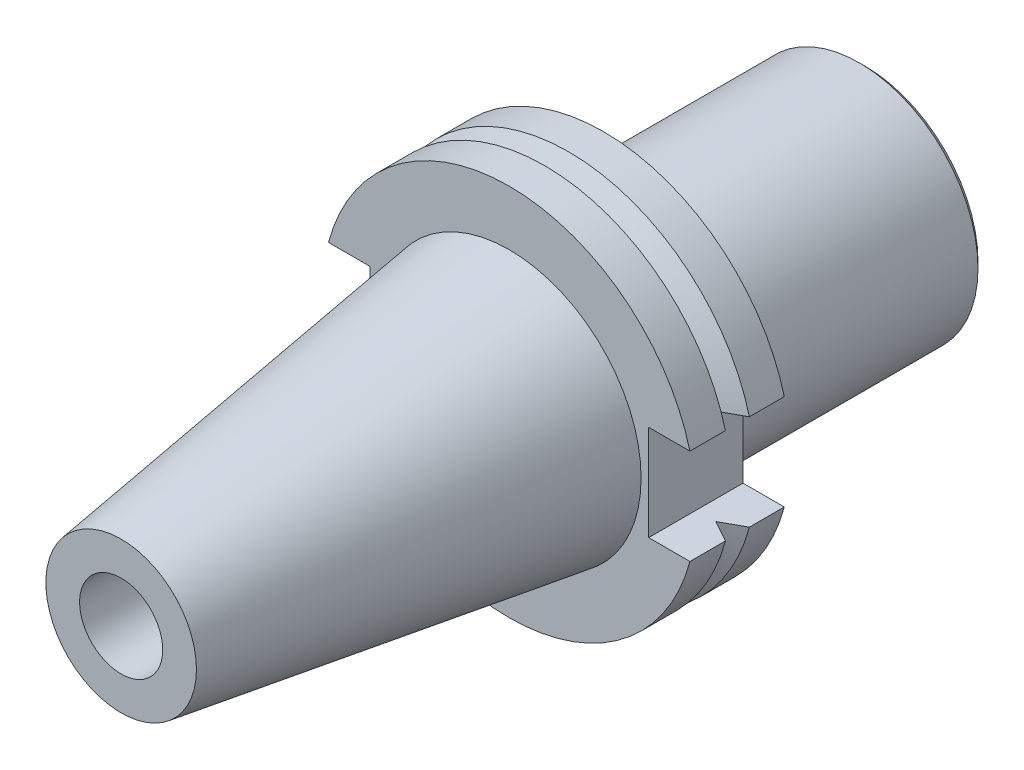
ISO-10303-21;
HEADER;
FILE_DESCRIPTION(('STEP AP214'),'2;1');
FILE_NAME('part.step','',(''),(''),'','','');
FILE_SCHEMA(('AUTOMOTIVE_DESIGN { 1 0 10303 214 1 1 1 1 }'));
ENDSEC;
DATA;
#1=APPLICATION_CONTEXT('core data for automotive mechanical design processes');
#2=APPLICATION_PROTOCOL_DEFINITION('international standard','automotive_design',2000,#1);
#3=PRODUCT_CONTEXT('',#1,'mechanical');
#4=PRODUCT('Part','Part','',(#3));
#5=PRODUCT_RELATED_PRODUCT_CATEGORY('part','',(#4));
#6=PRODUCT_DEFINITION_FORMATION('','',#4);
#7=PRODUCT_DEFINITION_CONTEXT('part definition',#1,'design');
#8=PRODUCT_DEFINITION('design','',#6,#7);
#9=PRODUCT_DEFINITION_SHAPE('','',#8);
#10=(LENGTH_UNIT() NAMED_UNIT(*) SI_UNIT(.MILLI.,.METRE.));
#11=(NAMED_UNIT(*) PLANE_ANGLE_UNIT() SI_UNIT($,.RADIAN.));
#12=(NAMED_UNIT(*) SI_UNIT($,.STERADIAN.) SOLID_ANGLE_UNIT());
#13=UNCERTAINTY_MEASURE_WITH_UNIT(LENGTH_MEASURE(1.E-05),#10,'distance_accuracy_value','');
#14=(GEOMETRIC_REPRESENTATION_CONTEXT(3) GLOBAL_UNCERTAINTY_ASSIGNED_CONTEXT((#13)) GLOBAL_UNIT_ASSIGNED_CONTEXT((#10,
#11,#12)) REPRESENTATION_CONTEXT('',''));
#15=CARTESIAN_POINT('',(0.,0.,0.));
#16=DIRECTION('',(0.,0.,1.));
#17=DIRECTION('',(1.,0.,0.));
#18=AXIS2_PLACEMENT_3D('',#15,#16,#17);
#19=CARTESIAN_POINT('',(0.,0.,65.4));
#20=DIRECTION('',(0.,0.,1.));
#21=DIRECTION('',(1.,0.,0.));
#22=AXIS2_PLACEMENT_3D('',#19,#20,#21);
#23=CYLINDRICAL_SURFACE('',#22,31.5);
#24=DIRECTION('',(0.,0.,1.));
#25=VECTOR('',#24,1.);
#26=CARTESIAN_POINT('',(30.4540227227866,8.05,65.4));
#27=LINE('',#26,#25);
#28=CARTESIAN_POINT('',(30.4540227227866,8.05,-15.9));
#29=VERTEX_POINT('',#28);
#30=CARTESIAN_POINT('',(30.4540227227866,8.05,-10.020725));
#31=VERTEX_POINT('',#30);
#32=EDGE_CURVE('E320',#29,#31,#27,.T.);
#33=ORIENTED_EDGE('',*,*,#32,.F.);
#34=CARTESIAN_POINT('',(0.,0.,-15.9));
#35=DIRECTION('',(0.,0.,1.));
#36=DIRECTION('',(1.,0.,0.));
#37=AXIS2_PLACEMENT_3D('',#34,#35,#36);
#38=CIRCLE('',#37,31.5);
#39=CARTESIAN_POINT('',(-30.4540227227866,8.05,-15.9));
#40=VERTEX_POINT('',#39);
#41=EDGE_CURVE('E351',#29,#40,#38,.T.);
#42=ORIENTED_EDGE('',*,*,#41,.T.);
#43=DIRECTION('',(0.,0.,1.));
#44=VECTOR('',#43,1.);
#45=CARTESIAN_POINT('',(-30.4540227227866,8.05,65.4));
#46=LINE('',#45,#44);
#47=CARTESIAN_POINT('',(-30.4540227227866,8.05,-10.020725));
#48=VERTEX_POINT('',#47);
#49=EDGE_CURVE('E260',#48,#40,#46,.F.);
#50=ORIENTED_EDGE('',*,*,#49,.F.);
#51=CARTESIAN_POINT('',(0.,0.,-10.020725));
#52=DIRECTION('',(0.,0.,-1.));
#53=DIRECTION('',(-1.,0.,0.));
#54=AXIS2_PLACEMENT_3D('',#51,#52,#53);
#55=CIRCLE('',#54,31.5);
#56=EDGE_CURVE('E342',#48,#31,#55,.T.);
#57=ORIENTED_EDGE('',*,*,#56,.T.);
#58=EDGE_LOOP('',(#33,#42,#50,#57));
#59=FACE_BOUND('',#58,.T.);
#60=ADVANCED_FACE('F51',(#59),#23,.T.);
#61=CARTESIAN_POINT('',(0.,0.,-10.3094));
#62=DIRECTION('',(0.,0.,-1.));
#63=DIRECTION('',(-1.,0.,0.));
#64=AXIS2_PLACEMENT_3D('',#61,#62,#63);
#65=CONICAL_SURFACE('',#64,32.,1.04719775308884);
#66=CARTESIAN_POINT('',(39.7514622989228,8.05,-15.2505740500649));
#67=CARTESIAN_POINT('',(38.7375794427899,8.05,-14.6768843385956));
#68=CARTESIAN_POINT('',(37.7233495112068,8.05,-14.1038062761903));
#69=CARTESIAN_POINT('',(35.6939559264031,8.05,-12.9593148687635));
#70=CARTESIAN_POINT('',(34.6787922766526,8.05,-12.3879015175877));
#71=CARTESIAN_POINT('',(32.6473671902745,8.05,-11.2472233085017));
#72=CARTESIAN_POINT('',(31.6311058501379,8.05,-10.6779582788319));
#73=CARTESIAN_POINT('',(29.597031458743,8.05,-9.54219070241251));
#74=CARTESIAN_POINT('',(28.5792183980375,8.05,-8.97568817257056));
#75=CARTESIAN_POINT('',(26.5414287246424,8.05,-7.84635750076335));
#76=CARTESIAN_POINT('',(25.5214519163326,8.05,-7.28352971157407));
#77=CARTESIAN_POINT('',(23.4786738109666,8.05,-6.16304932727975));
#78=CARTESIAN_POINT('',(22.455872557207,8.05,-5.60539665340947));
#79=CARTESIAN_POINT('',(20.9185737936278,8.05,-4.7745328012065));
#80=CARTESIAN_POINT('',(20.4056008747196,8.05,-4.49850137835459));
#81=CARTESIAN_POINT('',(19.3784142743255,8.05,-3.94876154777071));
#82=CARTESIAN_POINT('',(18.8642005991113,8.05,-3.67505312832806));
#83=CARTESIAN_POINT('',(17.8342256824117,8.05,-3.13049588904046));
#84=CARTESIAN_POINT('',(17.3184643637085,8.05,-2.85964721503148));
#85=CARTESIAN_POINT('',(16.5434009565917,8.05,-2.45609356430836));
#86=CARTESIAN_POINT('',(16.2848073130013,8.05,-2.32202774586417));
#87=CARTESIAN_POINT('',(15.7670869800636,8.05,-2.05492707318908));
#88=CARTESIAN_POINT('',(15.5079602886761,8.05,-1.92189222291352));
#89=CARTESIAN_POINT('',(15.2485377010772,8.05,-1.78943521854871));
#90=B_SPLINE_CURVE_WITH_KNOTS('',3,(#66,#67,#68,#69,#70,#71,#72,#73,#74,#75,#76,#77,#78,#79,#80,
#81,#82,#83,#84,#85,#86,#87,#88,#89),.UNSPECIFIED.,.F.,.F.,(4,2,2,2,2,2,2,2,2,2,2,4),(0.,
3.49481223341275,6.98961153065348,10.4841252317905,13.978660293995,17.4735260400842,
20.9683385067897,22.715906764079,24.4634662063209,26.2111143410334,27.0849537060668,
27.9587964219485),.UNSPECIFIED.);
#91=CARTESIAN_POINT('',(26.8178578562867,8.05,-8.));
#92=VERTEX_POINT('',#91);
#93=EDGE_CURVE('E313',#31,#92,#90,.T.);
#94=ORIENTED_EDGE('',*,*,#93,.F.);
#95=ORIENTED_EDGE('',*,*,#56,.F.);
#96=CARTESIAN_POINT('',(-15.2485377010772,8.05,-1.78943521854871));
#97=CARTESIAN_POINT('',(-15.5916110343136,8.05,-1.9646110043633));
#98=CARTESIAN_POINT('',(-15.9341715544753,8.05,-2.1407873482956));
#99=CARTESIAN_POINT('',(-16.6183922268298,8.05,-2.49487426660718));
#100=CARTESIAN_POINT('',(-16.9600523855997,8.05,-2.67278482827311));
#101=CARTESIAN_POINT('',(-17.6425931502126,8.05,-3.03007091555391));
#102=CARTESIAN_POINT('',(-17.9834737774147,8.05,-3.20944640039938));
#103=CARTESIAN_POINT('',(-18.6645653353504,8.05,-3.56946546957345));
#104=CARTESIAN_POINT('',(-19.0047762646719,8.05,-3.75010905657245));
#105=CARTESIAN_POINT('',(-20.0244897057141,8.05,-4.29365206630128));
#106=CARTESIAN_POINT('',(-20.7031198135981,8.05,-4.65818837430353));
#107=CARTESIAN_POINT('',(-22.0585899389783,8.05,-5.39058232129538));
#108=CARTESIAN_POINT('',(-22.7354299415383,8.05,-5.75843998788523));
#109=CARTESIAN_POINT('',(-24.087629684218,8.05,-6.49670884549036));
#110=CARTESIAN_POINT('',(-24.7629895618946,8.05,-6.86711978469141));
#111=CARTESIAN_POINT('',(-26.1125763620363,8.05,-7.60999409496285));
#112=CARTESIAN_POINT('',(-26.7868032877578,8.05,-7.98245746012054));
#113=CARTESIAN_POINT('',(-28.1343514607373,8.05,-8.72904663303512));
#114=CARTESIAN_POINT('',(-28.8076726916146,8.05,-9.1031724703468));
#115=CARTESIAN_POINT('',(-30.1535614024565,8.05,-9.85277794248402));
#116=CARTESIAN_POINT('',(-30.8261288819969,8.05,-10.2282575780709));
#117=CARTESIAN_POINT('',(-32.1871867195783,8.05,-10.9895941808429));
#118=CARTESIAN_POINT('',(-32.8756614610951,8.05,-11.3754790596674));
#119=CARTESIAN_POINT('',(-34.2520561934165,8.05,-12.1482260402481));
#120=CARTESIAN_POINT('',(-34.93997618787,8.05,-12.5350881355062));
#121=CARTESIAN_POINT('',(-36.3153814213353,8.05,-13.309652039574));
#122=CARTESIAN_POINT('',(-37.0028666407764,8.05,-13.6973538831291));
#123=CARTESIAN_POINT('',(-38.3774439079256,8.05,-14.4734643210686));
#124=CARTESIAN_POINT('',(-39.0645359530695,8.05,-14.8618729199949));
#125=CARTESIAN_POINT('',(-39.7514622989228,8.05,-15.2505740500649));
#126=B_SPLINE_CURVE_WITH_KNOTS('',3,(#96,#97,#98,#99,#100,#101,#102,#103,#104,#105,#106,#107,
#108,#109,#110,#111,#112,#113,#114,#115,#116,#117,#118,#119,#120,#121,#122,#123,#124,#125),
.UNSPECIFIED.,.F.,.F.,(4,2,2,2,2,2,2,2,2,2,2,2,2,2,4),(0.,1.15562246364795,2.31123646193108,
3.46681840787613,4.6224027880085,6.93341250597456,9.24444144596615,11.5552456340298,
13.8660431685069,16.1768819491207,18.4877220294254,20.8554502589415,23.2231627847701,
25.590975223069,27.9588029317647),.UNSPECIFIED.);
#127=CARTESIAN_POINT('',(-26.8178578562867,8.05,-8.));
#128=VERTEX_POINT('',#127);
#129=EDGE_CURVE('E253',#128,#48,#126,.T.);
#130=ORIENTED_EDGE('',*,*,#129,.F.);
#131=CARTESIAN_POINT('',(0.,0.,-8.));
#132=DIRECTION('',(0.,0.,-1.));
#133=DIRECTION('',(-1.,0.,0.));
#134=AXIS2_PLACEMENT_3D('',#131,#132,#133);
#135=CIRCLE('',#134,28.);
#136=EDGE_CURVE('E333',#128,#92,#135,.T.);
#137=ORIENTED_EDGE('',*,*,#136,.T.);
#138=EDGE_LOOP('',(#94,#95,#130,#137));
#139=FACE_BOUND('',#138,.T.);
#140=ADVANCED_FACE('F270',(#139),#65,.T.);
#141=CARTESIAN_POINT('',(0.,0.,-8.));
#142=DIRECTION('',(0.,0.,1.));
#143=DIRECTION('',(1.,0.,0.));
#144=AXIS2_PLACEMENT_3D('',#141,#142,#143);
#145=CONICAL_SURFACE('',#144,28.,1.04719775308884);
#146=CARTESIAN_POINT('',(15.2485377010772,8.05,-14.2105647814513));
#147=CARTESIAN_POINT('',(15.5916110343136,8.05,-14.0353889956367));
#148=CARTESIAN_POINT('',(15.9341715544753,8.05,-13.8592126517044));
#149=CARTESIAN_POINT('',(16.6183922268298,8.05,-13.5051257333928));
#150=CARTESIAN_POINT('',(16.9600523855997,8.05,-13.3272151717269));
#151=CARTESIAN_POINT('',(17.6425931502126,8.05,-12.9699290844461));
#152=CARTESIAN_POINT('',(17.9834737774147,8.05,-12.7905535996006));
#153=CARTESIAN_POINT('',(18.6645653353504,8.05,-12.4305345304266));
#154=CARTESIAN_POINT('',(19.0047762646719,8.05,-12.2498909434276));
#155=CARTESIAN_POINT('',(20.0244897057141,8.05,-11.7063479336987));
#156=CARTESIAN_POINT('',(20.7031198135981,8.05,-11.3418116256965));
#157=CARTESIAN_POINT('',(22.0585899389783,8.05,-10.6094176787046));
#158=CARTESIAN_POINT('',(22.7354299415383,8.05,-10.2415600121148));
#159=CARTESIAN_POINT('',(24.087629684218,8.05,-9.50329115450964));
#160=CARTESIAN_POINT('',(24.7629895618946,8.05,-9.13288021530859));
#161=CARTESIAN_POINT('',(26.1125763620363,8.05,-8.39000590503715));
#162=CARTESIAN_POINT('',(26.7868032877578,8.05,-8.01754253987946));
#163=CARTESIAN_POINT('',(28.1343514607373,8.05,-7.27095336696488));
#164=CARTESIAN_POINT('',(28.8076726916146,8.05,-6.8968275296532));
#165=CARTESIAN_POINT('',(30.1535614024565,8.05,-6.14722205751598));
#166=CARTESIAN_POINT('',(30.8261288819969,8.05,-5.77174242192914));
#167=CARTESIAN_POINT('',(32.1871867195783,8.05,-5.0104058191571));
#168=CARTESIAN_POINT('',(32.8756614610951,8.05,-4.62452094033265));
#169=CARTESIAN_POINT('',(34.2520561934165,8.05,-3.85177395975188));
#170=CARTESIAN_POINT('',(34.93997618787,8.05,-3.46491186449385));
#171=CARTESIAN_POINT('',(36.3153814213353,8.05,-2.69034796042602));
#172=CARTESIAN_POINT('',(37.0028666407764,8.05,-2.30264611687094));
#173=CARTESIAN_POINT('',(38.3774439079256,8.05,-1.52653567893138));
#174=CARTESIAN_POINT('',(39.0645359530695,8.05,-1.13812708000506));
#175=CARTESIAN_POINT('',(39.7514622989228,8.05,-0.749425949935081));
#176=B_SPLINE_CURVE_WITH_KNOTS('',3,(#146,#147,#148,#149,#150,#151,#152,#153,#154,#155,#156,
#157,#158,#159,#160,#161,#162,#163,#164,#165,#166,#167,#168,#169,#170,#171,#172,#173,#174,#175),
.UNSPECIFIED.,.F.,.F.,(4,2,2,2,2,2,2,2,2,2,2,2,2,2,4),(0.,1.15562246364795,2.31123646193109,
3.46681840787613,4.6224027880085,6.93341250597455,9.24444144596615,11.5552456340298,
13.8660431685069,16.1768819491207,18.4877220294254,20.8554502589415,23.2231627847701,
25.590975223069,27.9588029317647),.UNSPECIFIED.);
#177=CARTESIAN_POINT('',(30.4540227227866,8.05,-5.97927499999999));
#178=VERTEX_POINT('',#177);
#179=EDGE_CURVE('E308',#92,#178,#176,.T.);
#180=ORIENTED_EDGE('',*,*,#179,.F.);
#181=ORIENTED_EDGE('',*,*,#136,.F.);
#182=CARTESIAN_POINT('',(-39.7514622989228,8.05,-0.749425949935077));
#183=CARTESIAN_POINT('',(-38.7375794427899,8.05,-1.32311566140442));
#184=CARTESIAN_POINT('',(-37.7233495112068,8.05,-1.89619372380967));
#185=CARTESIAN_POINT('',(-35.6939559264031,8.05,-3.04068513123652));
#186=CARTESIAN_POINT('',(-34.6787922766526,8.05,-3.61209848241227));
#187=CARTESIAN_POINT('',(-32.6473671902745,8.05,-4.7527766914983));
#188=CARTESIAN_POINT('',(-31.6311058501379,8.05,-5.3220417211681));
#189=CARTESIAN_POINT('',(-29.597031458743,8.05,-6.45780929758748));
#190=CARTESIAN_POINT('',(-28.5792183980375,8.05,-7.02431182742944));
#191=CARTESIAN_POINT('',(-26.5414287246424,8.05,-8.15364249923665));
#192=CARTESIAN_POINT('',(-25.5214519163326,8.05,-8.71647028842593));
#193=CARTESIAN_POINT('',(-23.4786738109666,8.05,-9.83695067272024));
#194=CARTESIAN_POINT('',(-22.455872557207,8.05,-10.3946033465905));
#195=CARTESIAN_POINT('',(-20.9185737936278,8.05,-11.2254671987935));
#196=CARTESIAN_POINT('',(-20.4056008747196,8.05,-11.5014986216454));
#197=CARTESIAN_POINT('',(-19.3784142743255,8.05,-12.0512384522293));
#198=CARTESIAN_POINT('',(-18.8642005991113,8.05,-12.3249468716719));
#199=CARTESIAN_POINT('',(-17.8342256824117,8.05,-12.8695041109595));
#200=CARTESIAN_POINT('',(-17.3184643637085,8.05,-13.1403527849685));
#201=CARTESIAN_POINT('',(-16.5434009565917,8.05,-13.5439064356916));
#202=CARTESIAN_POINT('',(-16.2848073130013,8.05,-13.6779722541358));
#203=CARTESIAN_POINT('',(-15.7670869800636,8.05,-13.9450729268109));
#204=CARTESIAN_POINT('',(-15.5079602886761,8.05,-14.0781077770865));
#205=CARTESIAN_POINT('',(-15.2485377010772,8.05,-14.2105647814513));
#206=B_SPLINE_CURVE_WITH_KNOTS('',3,(#182,#183,#184,#185,#186,#187,#188,#189,#190,#191,#192,
#193,#194,#195,#196,#197,#198,#199,#200,#201,#202,#203,#204,#205),.UNSPECIFIED.,.F.,.F.,(4,2,2,
2,2,2,2,2,2,2,2,4),(0.,3.49481223341275,6.98961153065348,10.4841252317905,13.978660293995,
17.4735260400842,20.9683385067897,22.715906764079,24.4634662063209,26.2111143410334,
27.0849537060668,27.9587964219485),.UNSPECIFIED.);
#207=CARTESIAN_POINT('',(-30.4540227227866,8.05,-5.97927499999999));
#208=VERTEX_POINT('',#207);
#209=EDGE_CURVE('E246',#208,#128,#206,.T.);
#210=ORIENTED_EDGE('',*,*,#209,.F.);
#211=CARTESIAN_POINT('',(0.,0.,-5.979275));
#212=DIRECTION('',(0.,0.,1.));
#213=DIRECTION('',(1.,0.,0.));
#214=AXIS2_PLACEMENT_3D('',#211,#212,#213);
#215=CIRCLE('',#214,31.5);
#216=EDGE_CURVE('E368',#178,#208,#215,.T.);
#217=ORIENTED_EDGE('',*,*,#216,.F.);
#218=EDGE_LOOP('',(#180,#181,#210,#217));
#219=FACE_BOUND('',#218,.T.);
#220=ADVANCED_FACE('F495',(#219),#145,.T.);
#221=DIRECTION('',(0.,0.,1.));
#222=VECTOR('',#221,1.);
#223=CARTESIAN_POINT('',(30.4540227227866,8.05,65.4));
#224=LINE('',#223,#222);
#225=CARTESIAN_POINT('',(30.4540227227866,8.05,0.));
#226=VERTEX_POINT('',#225);
#227=EDGE_CURVE('E11',#178,#226,#224,.T.);
#228=ORIENTED_EDGE('',*,*,#227,.F.);
#229=ORIENTED_EDGE('',*,*,#216,.T.);
#230=DIRECTION('',(0.,0.,1.));
#231=VECTOR('',#230,1.);
#232=CARTESIAN_POINT('',(-30.4540227227866,8.05,65.4));
#233=LINE('',#232,#231);
#234=CARTESIAN_POINT('',(-30.4540227227866,8.05,0.));
#235=VERTEX_POINT('',#234);
#236=EDGE_CURVE('E377',#235,#208,#233,.F.);
#237=ORIENTED_EDGE('',*,*,#236,.F.);
#238=CARTESIAN_POINT('',(0.,0.,0.));
#239=DIRECTION('',(0.,0.,1.));
#240=DIRECTION('',(1.,0.,0.));
#241=AXIS2_PLACEMENT_3D('',#238,#239,#240);
#242=CIRCLE('',#241,31.5);
#243=EDGE_CURVE('E355',#226,#235,#242,.T.);
#244=ORIENTED_EDGE('',*,*,#243,.F.);
#245=EDGE_LOOP('',(#228,#229,#237,#244));
#246=FACE_BOUND('',#245,.T.);
#247=ADVANCED_FACE('F492',(#246),#23,.T.);
#248=DIRECTION('',(0.,0.,1.));
#249=VECTOR('',#248,1.);
#250=CARTESIAN_POINT('',(30.4540227227866,-8.05,65.4));
#251=LINE('',#250,#249);
#252=CARTESIAN_POINT('',(30.4540227227866,-8.05,-10.020725));
#253=VERTEX_POINT('',#252);
#254=CARTESIAN_POINT('',(30.4540227227866,-8.05,-15.9));
#255=VERTEX_POINT('',#254);
#256=EDGE_CURVE('E285',#253,#255,#251,.F.);
#257=ORIENTED_EDGE('',*,*,#256,.F.);
#258=CARTESIAN_POINT('',(-30.4540227227866,-8.05,-10.020725));
#259=VERTEX_POINT('',#258);
#260=EDGE_CURVE('E372',#253,#259,#55,.T.);
#261=ORIENTED_EDGE('',*,*,#260,.T.);
#262=DIRECTION('',(0.,0.,1.));
#263=VECTOR('',#262,1.);
#264=CARTESIAN_POINT('',(-30.4540227227866,-8.05,65.4));
#265=LINE('',#264,#263);
#266=CARTESIAN_POINT('',(-30.4540227227866,-8.05,-15.9));
#267=VERTEX_POINT('',#266);
#268=EDGE_CURVE('E419',#267,#259,#265,.T.);
#269=ORIENTED_EDGE('',*,*,#268,.F.);
#270=EDGE_CURVE('E350',#267,#255,#38,.T.);
#271=ORIENTED_EDGE('',*,*,#270,.T.);
#272=EDGE_LOOP('',(#257,#261,#269,#271));
#273=FACE_BOUND('',#272,.T.);
#274=ADVANCED_FACE('F418',(#273),#23,.T.);
#275=CARTESIAN_POINT('',(31.5,0.,-15.9));
#276=DIRECTION('',(0.,0.,-1.));
#277=DIRECTION('',(-1.,0.,0.));
#278=AXIS2_PLACEMENT_3D('',#275,#276,#277);
#279=PLANE('',#278);
#280=CARTESIAN_POINT('',(0.,25.,-15.9));
#281=DIRECTION('',(0.,0.,1.));
#282=DIRECTION('',(1.,0.,0.));
#283=AXIS2_PLACEMENT_3D('',#280,#281,#282);
#284=CIRCLE('',#283,4.);
#285=CARTESIAN_POINT('',(4.,25.,-15.9));
#286=VERTEX_POINT('',#285);
#287=EDGE_CURVE('E402',#286,#286,#284,.T.);
#288=ORIENTED_EDGE('',*,*,#287,.T.);
#289=EDGE_LOOP('',(#288));
#290=FACE_BOUND('',#289,.T.);
#291=DIRECTION('',(1.,0.,0.));
#292=VECTOR('',#291,1.);
#293=CARTESIAN_POINT('',(31.5,8.05,-15.9));
#294=LINE('',#293,#292);
#295=CARTESIAN_POINT('',(23.5,8.05,-15.9));
#296=VERTEX_POINT('',#295);
#297=EDGE_CURVE('E323',#296,#29,#294,.T.);
#298=ORIENTED_EDGE('',*,*,#297,.F.);
#299=DIRECTION('',(0.,1.,0.));
#300=VECTOR('',#299,1.);
#301=CARTESIAN_POINT('',(23.5,0.,-15.9));
#302=LINE('',#301,#300);
#303=CARTESIAN_POINT('',(23.5,-8.05,-15.9));
#304=VERTEX_POINT('',#303);
#305=EDGE_CURVE('E329',#304,#296,#302,.T.);
#306=ORIENTED_EDGE('',*,*,#305,.F.);
#307=DIRECTION('',(-1.,0.,0.));
#308=VECTOR('',#307,1.);
#309=CARTESIAN_POINT('',(31.5,-8.05,-15.9));
#310=LINE('',#309,#308);
#311=EDGE_CURVE('E155',#255,#304,#310,.T.);
#312=ORIENTED_EDGE('',*,*,#311,.F.);
#313=ORIENTED_EDGE('',*,*,#270,.F.);
#314=DIRECTION('',(-1.,0.,0.));
#315=VECTOR('',#314,1.);
#316=CARTESIAN_POINT('',(31.5,-8.05,-15.9));
#317=LINE('',#316,#315);
#318=CARTESIAN_POINT('',(-23.5,-8.05,-15.9));
#319=VERTEX_POINT('',#318);
#320=EDGE_CURVE('E422',#319,#267,#317,.T.);
#321=ORIENTED_EDGE('',*,*,#320,.F.);
#322=DIRECTION('',(0.,-1.,0.));
#323=VECTOR('',#322,1.);
#324=CARTESIAN_POINT('',(-23.5,0.,-15.9));
#325=LINE('',#324,#323);
#326=CARTESIAN_POINT('',(-23.5,8.05,-15.9));
#327=VERTEX_POINT('',#326);
#328=EDGE_CURVE('E326',#327,#319,#325,.T.);
#329=ORIENTED_EDGE('',*,*,#328,.F.);
#330=DIRECTION('',(1.,0.,0.));
#331=VECTOR('',#330,1.);
#332=CARTESIAN_POINT('',(31.5,8.05,-15.9));
#333=LINE('',#332,#331);
#334=EDGE_CURVE('E390',#40,#327,#333,.T.);
#335=ORIENTED_EDGE('',*,*,#334,.F.);
#336=ORIENTED_EDGE('',*,*,#41,.F.);
#337=EDGE_LOOP('',(#298,#306,#312,#313,#321,#329,#335,#336));
#338=FACE_BOUND('',#337,.T.);
#339=CARTESIAN_POINT('',(0.,0.,-15.9));
#340=DIRECTION('',(0.,0.,1.));
#341=DIRECTION('',(1.,0.,0.));
#342=AXIS2_PLACEMENT_3D('',#339,#340,#341);
#343=CIRCLE('',#342,20.);
#344=CARTESIAN_POINT('',(20.,0.,-15.9));
#345=VERTEX_POINT('',#344);
#346=EDGE_CURVE('E346',#345,#345,#343,.T.);
#347=ORIENTED_EDGE('',*,*,#346,.T.);
#348=EDGE_LOOP('',(#347));
#349=FACE_BOUND('',#348,.T.);
#350=ADVANCED_FACE('F414',(#290,#338,#349),#279,.T.);
#351=CARTESIAN_POINT('',(0.,0.,65.4));
#352=DIRECTION('',(0.,0.,1.));
#353=DIRECTION('',(1.,0.,0.));
#354=AXIS2_PLACEMENT_3D('',#351,#352,#353);
#355=CYLINDRICAL_SURFACE('',#354,20.);
#356=CARTESIAN_POINT('',(0.,0.,-59.));
#357=DIRECTION('',(0.,0.,1.));
#358=DIRECTION('',(1.,0.,0.));
#359=AXIS2_PLACEMENT_3D('',#356,#357,#358);
#360=CIRCLE('',#359,20.);
#361=CARTESIAN_POINT('',(20.,0.,-59.));
#362=VERTEX_POINT('',#361);
#363=EDGE_CURVE('E341',#362,#362,#360,.T.);
#364=ORIENTED_EDGE('',*,*,#363,.T.);
#365=EDGE_LOOP('',(#364));
#366=FACE_BOUND('',#365,.T.);
#367=ORIENTED_EDGE('',*,*,#346,.F.);
#368=EDGE_LOOP('',(#367));
#369=FACE_BOUND('',#368,.T.);
#370=ADVANCED_FACE('F504',(#366,#369),#355,.T.);
#371=CARTESIAN_POINT('',(0.,0.,-59.));
#372=DIRECTION('',(0.,0.,1.));
#373=DIRECTION('',(1.,0.,0.));
#374=AXIS2_PLACEMENT_3D('',#371,#372,#373);
#375=CONICAL_SURFACE('',#374,20.,0.785398163397442);
#376=CARTESIAN_POINT('',(0.,0.,-60.));
#377=DIRECTION('',(0.,0.,1.));
#378=DIRECTION('',(1.,0.,0.));
#379=AXIS2_PLACEMENT_3D('',#376,#377,#378);
#380=CIRCLE('',#379,19.);
#381=CARTESIAN_POINT('',(19.,0.,-60.));
#382=VERTEX_POINT('',#381);
#383=EDGE_CURVE('E338',#382,#382,#380,.T.);
#384=ORIENTED_EDGE('',*,*,#383,.T.);
#385=EDGE_LOOP('',(#384));
#386=FACE_BOUND('',#385,.T.);
#387=ORIENTED_EDGE('',*,*,#363,.F.);
#388=EDGE_LOOP('',(#387));
#389=FACE_BOUND('',#388,.T.);
#390=ADVANCED_FACE('F590',(#386,#389),#375,.T.);
#391=CARTESIAN_POINT('',(19.,0.,-60.));
#392=DIRECTION('',(0.,0.,-1.));
#393=DIRECTION('',(-1.,0.,0.));
#394=AXIS2_PLACEMENT_3D('',#391,#392,#393);
#395=PLANE('',#394);
#396=CARTESIAN_POINT('',(0.,0.,-60.));
#397=DIRECTION('',(0.,0.,1.));
#398=DIRECTION('',(1.,0.,0.));
#399=AXIS2_PLACEMENT_3D('',#396,#397,#398);
#400=CIRCLE('',#399,10.);
#401=CARTESIAN_POINT('',(10.,0.,-60.));
#402=VERTEX_POINT('',#401);
#403=EDGE_CURVE('E444',#402,#402,#400,.T.);
#404=ORIENTED_EDGE('',*,*,#403,.T.);
#405=EDGE_LOOP('',(#404));
#406=FACE_BOUND('',#405,.T.);
#407=ORIENTED_EDGE('',*,*,#383,.F.);
#408=EDGE_LOOP('',(#407));
#409=FACE_BOUND('',#408,.T.);
#410=ADVANCED_FACE('F268',(#406,#409),#395,.T.);
#411=CARTESIAN_POINT('',(15.2485377010772,-8.05,-1.78943521854871));
#412=CARTESIAN_POINT('',(15.5916110343136,-8.05,-1.9646110043633));
#413=CARTESIAN_POINT('',(15.9341715544753,-8.05,-2.1407873482956));
#414=CARTESIAN_POINT('',(16.6183922268298,-8.05,-2.49487426660718));
#415=CARTESIAN_POINT('',(16.9600523855997,-8.05,-2.67278482827311));
#416=CARTESIAN_POINT('',(17.6425931502126,-8.05,-3.03007091555391));
#417=CARTESIAN_POINT('',(17.9834737774147,-8.05,-3.20944640039938));
#418=CARTESIAN_POINT('',(18.6645653353504,-8.05,-3.56946546957345));
#419=CARTESIAN_POINT('',(19.0047762646719,-8.05,-3.75010905657245));
#420=CARTESIAN_POINT('',(20.0244897057141,-8.05,-4.29365206630128));
#421=CARTESIAN_POINT('',(20.7031198135981,-8.05,-4.65818837430353));
#422=CARTESIAN_POINT('',(22.0585899389783,-8.05,-5.39058232129538));
#423=CARTESIAN_POINT('',(22.7354299415383,-8.05,-5.75843998788523));
#424=CARTESIAN_POINT('',(24.087629684218,-8.05,-6.49670884549036));
#425=CARTESIAN_POINT('',(24.7629895618946,-8.05,-6.86711978469141));
#426=CARTESIAN_POINT('',(26.1125763620363,-8.05,-7.60999409496285));
#427=CARTESIAN_POINT('',(26.7868032877578,-8.05,-7.98245746012054));
#428=CARTESIAN_POINT('',(28.1343514607373,-8.05,-8.72904663303512));
#429=CARTESIAN_POINT('',(28.8076726916146,-8.05,-9.1031724703468));
#430=CARTESIAN_POINT('',(30.1535614024565,-8.05,-9.85277794248402));
#431=CARTESIAN_POINT('',(30.8261288819969,-8.05,-10.2282575780709));
#432=CARTESIAN_POINT('',(32.1871867195783,-8.05,-10.9895941808429));
#433=CARTESIAN_POINT('',(32.8756614610951,-8.05,-11.3754790596674));
#434=CARTESIAN_POINT('',(34.2520561934165,-8.05,-12.1482260402481));
#435=CARTESIAN_POINT('',(34.93997618787,-8.05,-12.5350881355062));
#436=CARTESIAN_POINT('',(36.3153814213353,-8.05,-13.309652039574));
#437=CARTESIAN_POINT('',(37.0028666407764,-8.05,-13.6973538831291));
#438=CARTESIAN_POINT('',(38.3774439079256,-8.05,-14.4734643210686));
#439=CARTESIAN_POINT('',(39.0645359530695,-8.05,-14.8618729199949));
#440=CARTESIAN_POINT('',(39.7514622989228,-8.05,-15.2505740500649));
#441=B_SPLINE_CURVE_WITH_KNOTS('',3,(#411,#412,#413,#414,#415,#416,#417,#418,#419,#420,#421,
#422,#423,#424,#425,#426,#427,#428,#429,#430,#431,#432,#433,#434,#435,#436,#437,#438,#439,#440),
.UNSPECIFIED.,.F.,.F.,(4,2,2,2,2,2,2,2,2,2,2,2,2,2,4),(0.,1.15562246364795,2.31123646193108,
3.46681840787613,4.6224027880085,6.93341250597456,9.24444144596615,11.5552456340298,
13.8660431685069,16.1768819491207,18.4877220294254,20.8554502589415,23.2231627847701,
25.590975223069,27.9588029317647),.UNSPECIFIED.);
#442=CARTESIAN_POINT('',(26.8178578562867,-8.05,-8.));
#443=VERTEX_POINT('',#442);
#444=EDGE_CURVE('E277',#443,#253,#441,.T.);
#445=ORIENTED_EDGE('',*,*,#444,.F.);
#446=CARTESIAN_POINT('',(-26.8178578562867,-8.05,-8.));
#447=VERTEX_POINT('',#446);
#448=EDGE_CURVE('E332',#443,#447,#135,.T.);
#449=ORIENTED_EDGE('',*,*,#448,.T.);
#450=CARTESIAN_POINT('',(-39.7514622989228,-8.05,-15.2505740500649));
#451=CARTESIAN_POINT('',(-38.7375794427899,-8.05,-14.6768843385956));
#452=CARTESIAN_POINT('',(-37.7233495112068,-8.05,-14.1038062761903));
#453=CARTESIAN_POINT('',(-35.6939559264031,-8.05,-12.9593148687635));
#454=CARTESIAN_POINT('',(-34.6787922766526,-8.05,-12.3879015175877));
#455=CARTESIAN_POINT('',(-32.6473671902745,-8.05,-11.2472233085017));
#456=CARTESIAN_POINT('',(-31.6311058501379,-8.05,-10.6779582788319));
#457=CARTESIAN_POINT('',(-29.597031458743,-8.05,-9.54219070241251));
#458=CARTESIAN_POINT('',(-28.5792183980375,-8.05,-8.97568817257056));
#459=CARTESIAN_POINT('',(-26.5414287246424,-8.05,-7.84635750076335));
#460=CARTESIAN_POINT('',(-25.5214519163326,-8.05,-7.28352971157407));
#461=CARTESIAN_POINT('',(-23.4786738109666,-8.05,-6.16304932727975));
#462=CARTESIAN_POINT('',(-22.455872557207,-8.05,-5.60539665340947));
#463=CARTESIAN_POINT('',(-20.9185737936278,-8.05,-4.7745328012065));
#464=CARTESIAN_POINT('',(-20.4056008747196,-8.05,-4.49850137835459));
#465=CARTESIAN_POINT('',(-19.3784142743255,-8.05,-3.94876154777071));
#466=CARTESIAN_POINT('',(-18.8642005991113,-8.05,-3.67505312832806));
#467=CARTESIAN_POINT('',(-17.8342256824117,-8.05,-3.13049588904046));
#468=CARTESIAN_POINT('',(-17.3184643637085,-8.05,-2.85964721503148));
#469=CARTESIAN_POINT('',(-16.5434009565917,-8.05,-2.45609356430836));
#470=CARTESIAN_POINT('',(-16.2848073130013,-8.05,-2.32202774586417));
#471=CARTESIAN_POINT('',(-15.7670869800636,-8.05,-2.05492707318908));
#472=CARTESIAN_POINT('',(-15.5079602886761,-8.05,-1.92189222291352));
#473=CARTESIAN_POINT('',(-15.2485377010772,-8.05,-1.78943521854871));
#474=B_SPLINE_CURVE_WITH_KNOTS('',3,(#450,#451,#452,#453,#454,#455,#456,#457,#458,#459,#460,
#461,#462,#463,#464,#465,#466,#467,#468,#469,#470,#471,#472,#473),.UNSPECIFIED.,.F.,.F.,(4,2,2,
2,2,2,2,2,2,2,2,4),(0.,3.49481223341275,6.98961153065348,10.4841252317905,13.978660293995,
17.4735260400842,20.9683385067897,22.715906764079,24.4634662063209,26.2111143410334,
27.0849537060668,27.9587964219485),.UNSPECIFIED.);
#475=EDGE_CURVE('E213',#259,#447,#474,.T.);
#476=ORIENTED_EDGE('',*,*,#475,.F.);
#477=ORIENTED_EDGE('',*,*,#260,.F.);
#478=EDGE_LOOP('',(#445,#449,#476,#477));
#479=FACE_BOUND('',#478,.T.);
#480=ADVANCED_FACE('F263',(#479),#65,.T.);
#481=CARTESIAN_POINT('',(39.7514622989228,-8.05,-0.749425949935077));
#482=CARTESIAN_POINT('',(38.7375794427899,-8.05,-1.32311566140441));
#483=CARTESIAN_POINT('',(37.7233495112068,-8.05,-1.89619372380967));
#484=CARTESIAN_POINT('',(35.6939559264031,-8.05,-3.04068513123652));
#485=CARTESIAN_POINT('',(34.6787922766526,-8.05,-3.61209848241227));
#486=CARTESIAN_POINT('',(32.6473671902745,-8.05,-4.7527766914983));
#487=CARTESIAN_POINT('',(31.6311058501379,-8.05,-5.3220417211681));
#488=CARTESIAN_POINT('',(29.597031458743,-8.05,-6.45780929758748));
#489=CARTESIAN_POINT('',(28.5792183980375,-8.05,-7.02431182742944));
#490=CARTESIAN_POINT('',(26.5414287246424,-8.05,-8.15364249923665));
#491=CARTESIAN_POINT('',(25.5214519163326,-8.05,-8.71647028842593));
#492=CARTESIAN_POINT('',(23.4786738109666,-8.05,-9.83695067272024));
#493=CARTESIAN_POINT('',(22.455872557207,-8.05,-10.3946033465905));
#494=CARTESIAN_POINT('',(20.9185737936278,-8.05,-11.2254671987935));
#495=CARTESIAN_POINT('',(20.4056008747196,-8.05,-11.5014986216454));
#496=CARTESIAN_POINT('',(19.3784142743255,-8.05,-12.0512384522293));
#497=CARTESIAN_POINT('',(18.8642005991113,-8.05,-12.3249468716719));
#498=CARTESIAN_POINT('',(17.8342256824117,-8.05,-12.8695041109595));
#499=CARTESIAN_POINT('',(17.3184643637085,-8.05,-13.1403527849685));
#500=CARTESIAN_POINT('',(16.5434009565917,-8.05,-13.5439064356916));
#501=CARTESIAN_POINT('',(16.2848073130013,-8.05,-13.6779722541358));
#502=CARTESIAN_POINT('',(15.7670869800636,-8.05,-13.9450729268109));
#503=CARTESIAN_POINT('',(15.5079602886761,-8.05,-14.0781077770865));
#504=CARTESIAN_POINT('',(15.2485377010772,-8.05,-14.2105647814513));
#505=B_SPLINE_CURVE_WITH_KNOTS('',3,(#481,#482,#483,#484,#485,#486,#487,#488,#489,#490,#491,
#492,#493,#494,#495,#496,#497,#498,#499,#500,#501,#502,#503,#504),.UNSPECIFIED.,.F.,.F.,(4,2,2,
2,2,2,2,2,2,2,2,4),(0.,3.49481223341275,6.98961153065348,10.4841252317905,13.978660293995,
17.4735260400842,20.9683385067897,22.715906764079,24.4634662063209,26.2111143410334,
27.0849537060668,27.9587964219485),.UNSPECIFIED.);
#506=CARTESIAN_POINT('',(30.4540227227866,-8.05,-5.97927499999999));
#507=VERTEX_POINT('',#506);
#508=EDGE_CURVE('E286',#507,#443,#505,.T.);
#509=ORIENTED_EDGE('',*,*,#508,.F.);
#510=CARTESIAN_POINT('',(-30.4540227227866,-8.05,-5.979275));
#511=VERTEX_POINT('',#510);
#512=EDGE_CURVE('E337',#511,#507,#215,.T.);
#513=ORIENTED_EDGE('',*,*,#512,.F.);
#514=CARTESIAN_POINT('',(-15.2485377010772,-8.05,-14.2105647814513));
#515=CARTESIAN_POINT('',(-15.5916110343136,-8.05,-14.0353889956367));
#516=CARTESIAN_POINT('',(-15.9341715544753,-8.05,-13.8592126517044));
#517=CARTESIAN_POINT('',(-16.6183922268298,-8.05,-13.5051257333928));
#518=CARTESIAN_POINT('',(-16.9600523855997,-8.05,-13.3272151717269));
#519=CARTESIAN_POINT('',(-17.6425931502126,-8.05,-12.9699290844461));
#520=CARTESIAN_POINT('',(-17.9834737774147,-8.05,-12.7905535996006));
#521=CARTESIAN_POINT('',(-18.6645653353504,-8.05,-12.4305345304266));
#522=CARTESIAN_POINT('',(-19.0047762646719,-8.05,-12.2498909434276));
#523=CARTESIAN_POINT('',(-20.0244897057141,-8.05,-11.7063479336987));
#524=CARTESIAN_POINT('',(-20.7031198135981,-8.05,-11.3418116256965));
#525=CARTESIAN_POINT('',(-22.0585899389783,-8.05,-10.6094176787046));
#526=CARTESIAN_POINT('',(-22.7354299415383,-8.05,-10.2415600121148));
#527=CARTESIAN_POINT('',(-24.087629684218,-8.05,-9.50329115450964));
#528=CARTESIAN_POINT('',(-24.7629895618946,-8.05,-9.13288021530859));
#529=CARTESIAN_POINT('',(-26.1125763620363,-8.05,-8.39000590503715));
#530=CARTESIAN_POINT('',(-26.7868032877578,-8.05,-8.01754253987946));
#531=CARTESIAN_POINT('',(-28.1343514607373,-8.05,-7.27095336696488));
#532=CARTESIAN_POINT('',(-28.8076726916146,-8.05,-6.8968275296532));
#533=CARTESIAN_POINT('',(-30.1535614024565,-8.05,-6.14722205751598));
#534=CARTESIAN_POINT('',(-30.8261288819969,-8.05,-5.77174242192914));
#535=CARTESIAN_POINT('',(-32.1871867195783,-8.05,-5.0104058191571));
#536=CARTESIAN_POINT('',(-32.8756614610951,-8.05,-4.62452094033265));
#537=CARTESIAN_POINT('',(-34.2520561934165,-8.05,-3.85177395975188));
#538=CARTESIAN_POINT('',(-34.93997618787,-8.05,-3.46491186449385));
#539=CARTESIAN_POINT('',(-36.3153814213353,-8.05,-2.69034796042602));
#540=CARTESIAN_POINT('',(-37.0028666407764,-8.05,-2.30264611687094));
#541=CARTESIAN_POINT('',(-38.3774439079256,-8.05,-1.52653567893138));
#542=CARTESIAN_POINT('',(-39.0645359530695,-8.05,-1.13812708000506));
#543=CARTESIAN_POINT('',(-39.7514622989228,-8.05,-0.749425949935081));
#544=B_SPLINE_CURVE_WITH_KNOTS('',3,(#514,#515,#516,#517,#518,#519,#520,#521,#522,#523,#524,
#525,#526,#527,#528,#529,#530,#531,#532,#533,#534,#535,#536,#537,#538,#539,#540,#541,#542,#543),
.UNSPECIFIED.,.F.,.F.,(4,2,2,2,2,2,2,2,2,2,2,2,2,2,4),(0.,1.15562246364795,2.31123646193109,
3.46681840787613,4.6224027880085,6.93341250597456,9.24444144596615,11.5552456340298,
13.8660431685069,16.1768819491207,18.4877220294254,20.8554502589415,23.2231627847701,
25.590975223069,27.9588029317647),.UNSPECIFIED.);
#545=EDGE_CURVE('E68',#447,#511,#544,.T.);
#546=ORIENTED_EDGE('',*,*,#545,.F.);
#547=ORIENTED_EDGE('',*,*,#448,.F.);
#548=EDGE_LOOP('',(#509,#513,#546,#547));
#549=FACE_BOUND('',#548,.T.);
#550=ADVANCED_FACE('F221',(#549),#145,.T.);
#551=CARTESIAN_POINT('',(0.,0.,65.4));
#552=DIRECTION('',(0.,0.,1.));
#553=DIRECTION('',(1.,0.,0.));
#554=AXIS2_PLACEMENT_3D('',#551,#552,#553);
#555=PLANE('',#554);
#556=CARTESIAN_POINT('',(0.,0.,65.4));
#557=DIRECTION('',(0.,0.,1.));
#558=DIRECTION('',(1.,0.,0.));
#559=AXIS2_PLACEMENT_3D('',#556,#557,#558);
#560=CIRCLE('',#559,7.);
#561=CARTESIAN_POINT('',(7.,0.,65.4));
#562=VERTEX_POINT('',#561);
#563=EDGE_CURVE('E395',#562,#562,#560,.T.);
#564=ORIENTED_EDGE('',*,*,#563,.F.);
#565=EDGE_LOOP('',(#564));
#566=FACE_BOUND('',#565,.T.);
#567=CARTESIAN_POINT('',(0.,0.,65.4));
#568=DIRECTION('',(0.,0.,1.));
#569=DIRECTION('',(1.,0.,0.));
#570=AXIS2_PLACEMENT_3D('',#567,#568,#569);
#571=CIRCLE('',#570,12.6875);
#572=CARTESIAN_POINT('',(12.6875,0.,65.4));
#573=VERTEX_POINT('',#572);
#574=EDGE_CURVE('E363',#573,#573,#571,.T.);
#575=ORIENTED_EDGE('',*,*,#574,.T.);
#576=EDGE_LOOP('',(#575));
#577=FACE_BOUND('',#576,.T.);
#578=ADVANCED_FACE('F54',(#566,#577),#555,.T.);
#579=CARTESIAN_POINT('',(0.,0.,65.4));
#580=DIRECTION('',(0.,0.,-1.));
#581=DIRECTION('',(-1.,0.,0.));
#582=AXIS2_PLACEMENT_3D('',#579,#580,#581);
#583=CONICAL_SURFACE('',#582,12.6875,0.144812498238939);
#584=CARTESIAN_POINT('',(0.,0.,0.));
#585=DIRECTION('',(0.,0.,1.));
#586=DIRECTION('',(1.,0.,0.));
#587=AXIS2_PLACEMENT_3D('',#584,#585,#586);
#588=CIRCLE('',#587,22.225);
#589=CARTESIAN_POINT('',(22.225,0.,0.));
#590=VERTEX_POINT('',#589);
#591=EDGE_CURVE('E359',#590,#590,#588,.T.);
#592=ORIENTED_EDGE('',*,*,#591,.T.);
#593=EDGE_LOOP('',(#592));
#594=FACE_BOUND('',#593,.T.);
#595=ORIENTED_EDGE('',*,*,#574,.F.);
#596=EDGE_LOOP('',(#595));
#597=FACE_BOUND('',#596,.T.);
#598=ADVANCED_FACE('F480',(#594,#597),#583,.T.);
#599=CARTESIAN_POINT('',(22.225,0.,0.));
#600=DIRECTION('',(0.,0.,1.));
#601=DIRECTION('',(1.,0.,0.));
#602=AXIS2_PLACEMENT_3D('',#599,#600,#601);
#603=PLANE('',#602);
#604=DIRECTION('',(-1.,0.,0.));
#605=VECTOR('',#604,1.);
#606=CARTESIAN_POINT('',(33.,8.05,0.));
#607=LINE('',#606,#605);
#608=CARTESIAN_POINT('',(23.5,8.05,0.));
#609=VERTEX_POINT('',#608);
#610=EDGE_CURVE('E160',#226,#609,#607,.T.);
#611=ORIENTED_EDGE('',*,*,#610,.F.);
#612=ORIENTED_EDGE('',*,*,#243,.T.);
#613=DIRECTION('',(-1.,0.,0.));
#614=VECTOR('',#613,1.);
#615=CARTESIAN_POINT('',(-23.5,8.05,0.));
#616=LINE('',#615,#614);
#617=CARTESIAN_POINT('',(-23.5,8.05,0.));
#618=VERTEX_POINT('',#617);
#619=EDGE_CURVE('E191',#618,#235,#616,.T.);
#620=ORIENTED_EDGE('',*,*,#619,.F.);
#621=DIRECTION('',(0.,1.,0.));
#622=VECTOR('',#621,1.);
#623=CARTESIAN_POINT('',(-23.5,-8.05,0.));
#624=LINE('',#623,#622);
#625=CARTESIAN_POINT('',(-23.5,-8.05,0.));
#626=VERTEX_POINT('',#625);
#627=EDGE_CURVE('E198',#626,#618,#624,.T.);
#628=ORIENTED_EDGE('',*,*,#627,.F.);
#629=DIRECTION('',(1.,0.,0.));
#630=VECTOR('',#629,1.);
#631=CARTESIAN_POINT('',(-33.,-8.05,0.));
#632=LINE('',#631,#630);
#633=CARTESIAN_POINT('',(-30.4540227227866,-8.05,0.));
#634=VERTEX_POINT('',#633);
#635=EDGE_CURVE('E170',#634,#626,#632,.T.);
#636=ORIENTED_EDGE('',*,*,#635,.F.);
#637=CARTESIAN_POINT('',(30.4540227227866,-8.05,0.));
#638=VERTEX_POINT('',#637);
#639=EDGE_CURVE('E177',#634,#638,#242,.T.);
#640=ORIENTED_EDGE('',*,*,#639,.T.);
#641=DIRECTION('',(1.,0.,0.));
#642=VECTOR('',#641,1.);
#643=CARTESIAN_POINT('',(23.5,-8.05,0.));
#644=LINE('',#643,#642);
#645=CARTESIAN_POINT('',(23.5,-8.05,0.));
#646=VERTEX_POINT('',#645);
#647=EDGE_CURVE('E76',#646,#638,#644,.T.);
#648=ORIENTED_EDGE('',*,*,#647,.F.);
#649=DIRECTION('',(0.,-1.,0.));
#650=VECTOR('',#649,1.);
#651=CARTESIAN_POINT('',(23.5,8.05,0.));
#652=LINE('',#651,#650);
#653=EDGE_CURVE('E163',#609,#646,#652,.T.);
#654=ORIENTED_EDGE('',*,*,#653,.F.);
#655=EDGE_LOOP('',(#611,#612,#620,#628,#636,#640,#648,#654));
#656=FACE_BOUND('',#655,.T.);
#657=ORIENTED_EDGE('',*,*,#591,.F.);
#658=EDGE_LOOP('',(#657));
#659=FACE_BOUND('',#658,.T.);
#660=ADVANCED_FACE('F173',(#656,#659),#603,.T.);
#661=DIRECTION('',(0.,0.,1.));
#662=VECTOR('',#661,1.);
#663=CARTESIAN_POINT('',(30.4540227227866,-8.05,65.4));
#664=LINE('',#663,#662);
#665=EDGE_CURVE('E61',#638,#507,#664,.F.);
#666=ORIENTED_EDGE('',*,*,#665,.F.);
#667=ORIENTED_EDGE('',*,*,#639,.F.);
#668=DIRECTION('',(0.,0.,1.));
#669=VECTOR('',#668,1.);
#670=CARTESIAN_POINT('',(-30.4540227227866,-8.05,65.4));
#671=LINE('',#670,#669);
#672=EDGE_CURVE('E367',#511,#634,#671,.T.);
#673=ORIENTED_EDGE('',*,*,#672,.F.);
#674=ORIENTED_EDGE('',*,*,#512,.T.);
#675=EDGE_LOOP('',(#666,#667,#673,#674));
#676=FACE_BOUND('',#675,.T.);
#677=ADVANCED_FACE('F242',(#676),#23,.T.);
#678=CARTESIAN_POINT('',(-23.5,8.05,-60.));
#679=DIRECTION('',(0.,1.,0.));
#680=DIRECTION('',(0.,0.,1.));
#681=AXIS2_PLACEMENT_3D('',#678,#679,#680);
#682=PLANE('',#681);
#683=ORIENTED_EDGE('',*,*,#334,.T.);
#684=DIRECTION('',(0.,0.,1.));
#685=VECTOR('',#684,1.);
#686=CARTESIAN_POINT('',(-23.5,8.05,-60.));
#687=LINE('',#686,#685);
#688=EDGE_CURVE('E192',#327,#618,#687,.T.);
#689=ORIENTED_EDGE('',*,*,#688,.T.);
#690=ORIENTED_EDGE('',*,*,#619,.T.);
#691=ORIENTED_EDGE('',*,*,#236,.T.);
#692=ORIENTED_EDGE('',*,*,#209,.T.);
#693=ORIENTED_EDGE('',*,*,#129,.T.);
#694=ORIENTED_EDGE('',*,*,#49,.T.);
#695=EDGE_LOOP('',(#683,#689,#690,#691,#692,#693,#694));
#696=FACE_BOUND('',#695,.T.);
#697=ADVANCED_FACE('F237',(#696),#682,.F.);
#698=CARTESIAN_POINT('',(-23.5,-8.05,-60.));
#699=DIRECTION('',(1.,0.,0.));
#700=DIRECTION('',(0.,0.,-1.));
#701=AXIS2_PLACEMENT_3D('',#698,#699,#700);
#702=PLANE('',#701);
#703=ORIENTED_EDGE('',*,*,#328,.T.);
#704=DIRECTION('',(0.,0.,1.));
#705=VECTOR('',#704,1.);
#706=CARTESIAN_POINT('',(-23.5,-8.05,-60.));
#707=LINE('',#706,#705);
#708=EDGE_CURVE('E188',#319,#626,#707,.T.);
#709=ORIENTED_EDGE('',*,*,#708,.T.);
#710=ORIENTED_EDGE('',*,*,#627,.T.);
#711=ORIENTED_EDGE('',*,*,#688,.F.);
#712=EDGE_LOOP('',(#703,#709,#710,#711));
#713=FACE_BOUND('',#712,.T.);
#714=ADVANCED_FACE('F232',(#713),#702,.F.);
#715=CARTESIAN_POINT('',(-33.,-8.05,-60.));
#716=DIRECTION('',(0.,-1.,0.));
#717=DIRECTION('',(0.,0.,-1.));
#718=AXIS2_PLACEMENT_3D('',#715,#716,#717);
#719=PLANE('',#718);
#720=ORIENTED_EDGE('',*,*,#320,.T.);
#721=ORIENTED_EDGE('',*,*,#268,.T.);
#722=ORIENTED_EDGE('',*,*,#475,.T.);
#723=ORIENTED_EDGE('',*,*,#545,.T.);
#724=ORIENTED_EDGE('',*,*,#672,.T.);
#725=ORIENTED_EDGE('',*,*,#635,.T.);
#726=ORIENTED_EDGE('',*,*,#708,.F.);
#727=EDGE_LOOP('',(#720,#721,#722,#723,#724,#725,#726));
#728=FACE_BOUND('',#727,.T.);
#729=ADVANCED_FACE('F225',(#728),#719,.F.);
#730=CARTESIAN_POINT('',(23.5,8.05,-60.));
#731=DIRECTION('',(-1.,0.,0.));
#732=DIRECTION('',(0.,0.,1.));
#733=AXIS2_PLACEMENT_3D('',#730,#731,#732);
#734=PLANE('',#733);
#735=ORIENTED_EDGE('',*,*,#305,.T.);
#736=DIRECTION('',(0.,0.,1.));
#737=VECTOR('',#736,1.);
#738=CARTESIAN_POINT('',(23.5,8.05,-60.));
#739=LINE('',#738,#737);
#740=EDGE_CURVE('E159',#296,#609,#739,.T.);
#741=ORIENTED_EDGE('',*,*,#740,.T.);
#742=ORIENTED_EDGE('',*,*,#653,.T.);
#743=DIRECTION('',(0.,0.,1.));
#744=VECTOR('',#743,1.);
#745=CARTESIAN_POINT('',(23.5,-8.05,-60.));
#746=LINE('',#745,#744);
#747=EDGE_CURVE('E151',#304,#646,#746,.T.);
#748=ORIENTED_EDGE('',*,*,#747,.F.);
#749=EDGE_LOOP('',(#735,#741,#742,#748));
#750=FACE_BOUND('',#749,.T.);
#751=ADVANCED_FACE('F164',(#750),#734,.F.);
#752=CARTESIAN_POINT('',(33.,8.05,-60.));
#753=DIRECTION('',(0.,1.,0.));
#754=DIRECTION('',(0.,0.,1.));
#755=AXIS2_PLACEMENT_3D('',#752,#753,#754);
#756=PLANE('',#755);
#757=ORIENTED_EDGE('',*,*,#297,.T.);
#758=ORIENTED_EDGE('',*,*,#32,.T.);
#759=ORIENTED_EDGE('',*,*,#93,.T.);
#760=ORIENTED_EDGE('',*,*,#179,.T.);
#761=ORIENTED_EDGE('',*,*,#227,.T.);
#762=ORIENTED_EDGE('',*,*,#610,.T.);
#763=ORIENTED_EDGE('',*,*,#740,.F.);
#764=EDGE_LOOP('',(#757,#758,#759,#760,#761,#762,#763));
#765=FACE_BOUND('',#764,.T.);
#766=ADVANCED_FACE('F299',(#765),#756,.F.);
#767=CARTESIAN_POINT('',(23.5,-8.05,-60.));
#768=DIRECTION('',(0.,-1.,0.));
#769=DIRECTION('',(0.,0.,-1.));
#770=AXIS2_PLACEMENT_3D('',#767,#768,#769);
#771=PLANE('',#770);
#772=ORIENTED_EDGE('',*,*,#311,.T.);
#773=ORIENTED_EDGE('',*,*,#747,.T.);
#774=ORIENTED_EDGE('',*,*,#647,.T.);
#775=ORIENTED_EDGE('',*,*,#665,.T.);
#776=ORIENTED_EDGE('',*,*,#508,.T.);
#777=ORIENTED_EDGE('',*,*,#444,.T.);
#778=ORIENTED_EDGE('',*,*,#256,.T.);
#779=EDGE_LOOP('',(#772,#773,#774,#775,#776,#777,#778));
#780=FACE_BOUND('',#779,.T.);
#781=ADVANCED_FACE('F153',(#780),#771,.F.);
#782=CARTESIAN_POINT('',(0.,25.,-9.9));
#783=DIRECTION('',(0.,0.,-1.));
#784=DIRECTION('',(-1.,0.,0.));
#785=AXIS2_PLACEMENT_3D('',#782,#783,#784);
#786=CYLINDRICAL_SURFACE('',#785,4.);
#787=CARTESIAN_POINT('',(0.,25.,-9.9));
#788=DIRECTION('',(0.,0.,1.));
#789=DIRECTION('',(1.,0.,0.));
#790=AXIS2_PLACEMENT_3D('',#787,#788,#789);
#791=CIRCLE('',#790,4.);
#792=CARTESIAN_POINT('',(4.,25.,-9.9));
#793=VERTEX_POINT('',#792);
#794=EDGE_CURVE('E195',#793,#793,#791,.T.);
#795=ORIENTED_EDGE('',*,*,#794,.T.);
#796=EDGE_LOOP('',(#795));
#797=FACE_BOUND('',#796,.T.);
#798=ORIENTED_EDGE('',*,*,#287,.F.);
#799=EDGE_LOOP('',(#798));
#800=FACE_BOUND('',#799,.T.);
#801=ADVANCED_FACE('F298',(#797,#800),#786,.F.);
#802=CARTESIAN_POINT('',(0.,25.,-9.9));
#803=DIRECTION('',(0.,0.,1.));
#804=DIRECTION('',(1.,0.,0.));
#805=AXIS2_PLACEMENT_3D('',#802,#803,#804);
#806=PLANE('',#805);
#807=ORIENTED_EDGE('',*,*,#794,.F.);
#808=EDGE_LOOP('',(#807));
#809=FACE_BOUND('',#808,.T.);
#810=ADVANCED_FACE('F526',(#809),#806,.F.);
#811=CARTESIAN_POINT('',(0.,0.,-9.99999999999999));
#812=DIRECTION('',(0.,0.,-1.));
#813=DIRECTION('',(-1.,0.,0.));
#814=AXIS2_PLACEMENT_3D('',#811,#812,#813);
#815=CYLINDRICAL_SURFACE('',#814,10.);
#816=CARTESIAN_POINT('',(0.,0.,-9.99999999999999));
#817=DIRECTION('',(0.,0.,1.));
#818=DIRECTION('',(1.,0.,0.));
#819=AXIS2_PLACEMENT_3D('',#816,#817,#818);
#820=CIRCLE('',#819,10.);
#821=CARTESIAN_POINT('',(10.,0.,-9.99999999999999));
#822=VERTEX_POINT('',#821);
#823=EDGE_CURVE('E441',#822,#822,#820,.T.);
#824=ORIENTED_EDGE('',*,*,#823,.T.);
#825=EDGE_LOOP('',(#824));
#826=FACE_BOUND('',#825,.T.);
#827=ORIENTED_EDGE('',*,*,#403,.F.);
#828=EDGE_LOOP('',(#827));
#829=FACE_BOUND('',#828,.T.);
#830=ADVANCED_FACE('F531',(#826,#829),#815,.F.);
#831=CARTESIAN_POINT('',(0.,0.,-9.99999999999999));
#832=DIRECTION('',(0.,0.,1.));
#833=DIRECTION('',(1.,0.,0.));
#834=AXIS2_PLACEMENT_3D('',#831,#832,#833);
#835=PLANE('',#834);
#836=CARTESIAN_POINT('',(0.,0.,-10.));
#837=DIRECTION('',(0.,0.,1.));
#838=DIRECTION('',(1.,0.,0.));
#839=AXIS2_PLACEMENT_3D('',#836,#837,#838);
#840=CIRCLE('',#839,3.);
#841=CARTESIAN_POINT('',(3.,0.,-10.));
#842=VERTEX_POINT('',#841);
#843=EDGE_CURVE('E454',#842,#842,#840,.T.);
#844=ORIENTED_EDGE('',*,*,#843,.T.);
#845=EDGE_LOOP('',(#844));
#846=FACE_BOUND('',#845,.T.);
#847=ORIENTED_EDGE('',*,*,#823,.F.);
#848=EDGE_LOOP('',(#847));
#849=FACE_BOUND('',#848,.T.);
#850=ADVANCED_FACE('F474',(#846,#849),#835,.F.);
#851=CARTESIAN_POINT('',(0.,0.,35.4));
#852=DIRECTION('',(0.,0.,1.));
#853=DIRECTION('',(1.,0.,0.));
#854=AXIS2_PLACEMENT_3D('',#851,#852,#853);
#855=CYLINDRICAL_SURFACE('',#854,7.);
#856=CARTESIAN_POINT('',(0.,0.,35.4));
#857=DIRECTION('',(0.,0.,1.));
#858=DIRECTION('',(1.,0.,0.));
#859=AXIS2_PLACEMENT_3D('',#856,#857,#858);
#860=CIRCLE('',#859,7.);
#861=CARTESIAN_POINT('',(7.,0.,35.4));
#862=VERTEX_POINT('',#861);
#863=EDGE_CURVE('E398',#862,#862,#860,.T.);
#864=ORIENTED_EDGE('',*,*,#863,.F.);
#865=EDGE_LOOP('',(#864));
#866=FACE_BOUND('',#865,.T.);
#867=ORIENTED_EDGE('',*,*,#563,.T.);
#868=EDGE_LOOP('',(#867));
#869=FACE_BOUND('',#868,.T.);
#870=ADVANCED_FACE('F468',(#866,#869),#855,.F.);
#871=CARTESIAN_POINT('',(0.,0.,35.4));
#872=DIRECTION('',(0.,0.,1.));
#873=DIRECTION('',(1.,0.,0.));
#874=AXIS2_PLACEMENT_3D('',#871,#872,#873);
#875=PLANE('',#874);
#876=CARTESIAN_POINT('',(0.,0.,35.4));
#877=DIRECTION('',(0.,0.,1.));
#878=DIRECTION('',(1.,0.,0.));
#879=AXIS2_PLACEMENT_3D('',#876,#877,#878);
#880=CIRCLE('',#879,3.);
#881=CARTESIAN_POINT('',(3.,0.,35.4));
#882=VERTEX_POINT('',#881);
#883=EDGE_CURVE('E399',#882,#882,#880,.T.);
#884=ORIENTED_EDGE('',*,*,#883,.F.);
#885=EDGE_LOOP('',(#884));
#886=FACE_BOUND('',#885,.T.);
#887=ORIENTED_EDGE('',*,*,#863,.T.);
#888=EDGE_LOOP('',(#887));
#889=FACE_BOUND('',#888,.T.);
#890=ADVANCED_FACE('F465',(#886,#889),#875,.T.);
#891=CARTESIAN_POINT('',(0.,0.,35.4));
#892=DIRECTION('',(0.,0.,-1.));
#893=DIRECTION('',(-1.,0.,0.));
#894=AXIS2_PLACEMENT_3D('',#891,#892,#893);
#895=CYLINDRICAL_SURFACE('',#894,3.);
#896=ORIENTED_EDGE('',*,*,#883,.T.);
#897=EDGE_LOOP('',(#896));
#898=FACE_BOUND('',#897,.T.);
#899=ORIENTED_EDGE('',*,*,#843,.F.);
#900=EDGE_LOOP('',(#899));
#901=FACE_BOUND('',#900,.T.);
#902=ADVANCED_FACE('F462',(#898,#901),#895,.F.);
#903=CLOSED_SHELL('',(#60,#140,#220,#247,#274,#350,#370,#390,#410,#480,#550,#578,#598,#660,#677,
#697,#714,#729,#751,#766,#781,#801,#810,#830,#850,#870,#890,#902));
#904=MANIFOLD_SOLID_BREP('B2',#903);
#905=ADVANCED_BREP_SHAPE_REPRESENTATION('',(#18,#904),#14);
#906=SHAPE_DEFINITION_REPRESENTATION(#9,#905);
ENDSEC;
END-ISO-10303-21;
